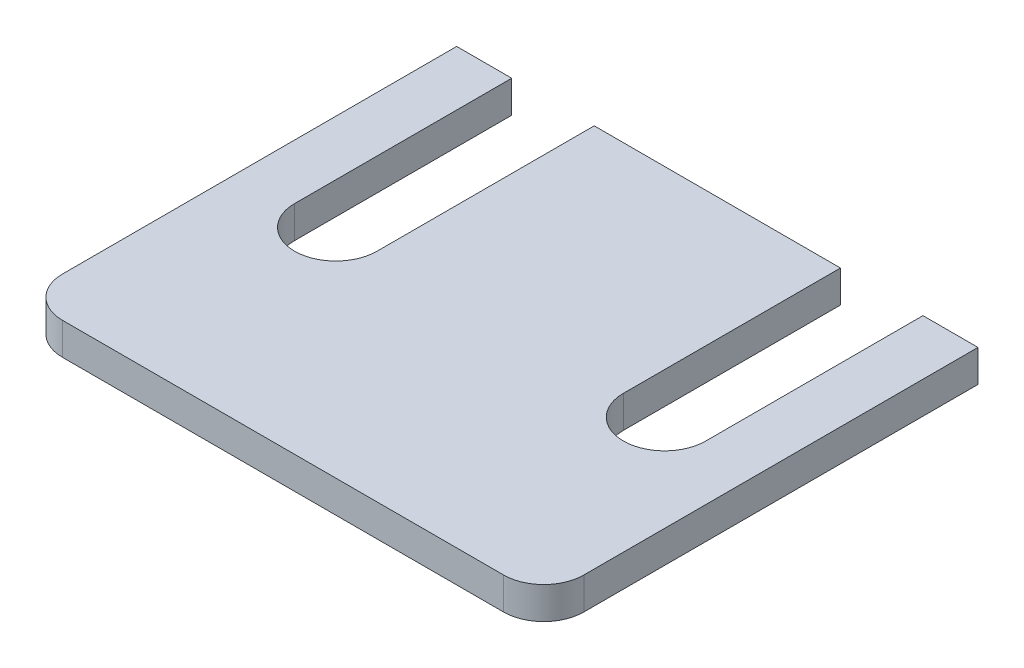
ISO-10303-21;
HEADER;
FILE_DESCRIPTION(('STEP AP214'),'2;1');
FILE_NAME('part.step','',(''),(''),'','','');
FILE_SCHEMA(('AUTOMOTIVE_DESIGN { 1 0 10303 214 1 1 1 1 }'));
ENDSEC;
DATA;
#1=APPLICATION_CONTEXT('core data for automotive mechanical design processes');
#2=APPLICATION_PROTOCOL_DEFINITION('international standard','automotive_design',2000,#1);
#3=PRODUCT_CONTEXT('',#1,'mechanical');
#4=PRODUCT('Part','Part','',(#3));
#5=PRODUCT_RELATED_PRODUCT_CATEGORY('part','',(#4));
#6=PRODUCT_DEFINITION_FORMATION('','',#4);
#7=PRODUCT_DEFINITION_CONTEXT('part definition',#1,'design');
#8=PRODUCT_DEFINITION('design','',#6,#7);
#9=PRODUCT_DEFINITION_SHAPE('','',#8);
#10=(LENGTH_UNIT() NAMED_UNIT(*) SI_UNIT(.MILLI.,.METRE.));
#11=(NAMED_UNIT(*) PLANE_ANGLE_UNIT() SI_UNIT($,.RADIAN.));
#12=(NAMED_UNIT(*) SI_UNIT($,.STERADIAN.) SOLID_ANGLE_UNIT());
#13=UNCERTAINTY_MEASURE_WITH_UNIT(LENGTH_MEASURE(1.E-05),#10,'distance_accuracy_value','');
#14=(GEOMETRIC_REPRESENTATION_CONTEXT(3) GLOBAL_UNCERTAINTY_ASSIGNED_CONTEXT((#13)) GLOBAL_UNIT_ASSIGNED_CONTEXT((#10,
#11,#12)) REPRESENTATION_CONTEXT('',''));
#15=CARTESIAN_POINT('',(0.,0.,0.));
#16=DIRECTION('',(0.,0.,1.));
#17=DIRECTION('',(1.,0.,0.));
#18=AXIS2_PLACEMENT_3D('',#15,#16,#17);
#19=CARTESIAN_POINT('',(-20.626678457,2.54,-17.1831));
#20=DIRECTION('',(0.,0.,1.));
#21=DIRECTION('',(1.,0.,0.));
#22=AXIS2_PLACEMENT_3D('',#19,#20,#21);
#23=PLANE('',#22);
#24=DIRECTION('',(-1.,0.,0.));
#25=VECTOR('',#24,1.);
#26=CARTESIAN_POINT('',(-20.626678457,2.54,-17.1831));
#27=LINE('',#26,#25);
#28=CARTESIAN_POINT('',(-16.270578457,2.54,-17.1831));
#29=VERTEX_POINT('',#28);
#30=CARTESIAN_POINT('',(-20.626678457,2.54,-17.1831));
#31=VERTEX_POINT('',#30);
#32=EDGE_CURVE('E216',#29,#31,#27,.T.);
#33=ORIENTED_EDGE('',*,*,#32,.F.);
#34=DIRECTION('',(0.,1.,0.));
#35=VECTOR('',#34,1.);
#36=CARTESIAN_POINT('',(-16.270578457,0.,-17.1831));
#37=LINE('',#36,#35);
#38=CARTESIAN_POINT('',(-16.270578457,0.,-17.1831));
#39=VERTEX_POINT('',#38);
#40=EDGE_CURVE('E154',#39,#29,#37,.T.);
#41=ORIENTED_EDGE('',*,*,#40,.F.);
#42=DIRECTION('',(-1.,0.,0.));
#43=VECTOR('',#42,1.);
#44=CARTESIAN_POINT('',(-20.626678457,0.,-17.1831));
#45=LINE('',#44,#43);
#46=CARTESIAN_POINT('',(-20.626678457,0.,-17.1831));
#47=VERTEX_POINT('',#46);
#48=EDGE_CURVE('E172',#39,#47,#45,.T.);
#49=ORIENTED_EDGE('',*,*,#48,.T.);
#50=DIRECTION('',(0.,-1.,0.));
#51=VECTOR('',#50,1.);
#52=CARTESIAN_POINT('',(-20.626678457,2.54,-17.1831));
#53=LINE('',#52,#51);
#54=EDGE_CURVE('E182',#31,#47,#53,.T.);
#55=ORIENTED_EDGE('',*,*,#54,.F.);
#56=EDGE_LOOP('',(#33,#41,#49,#55));
#57=FACE_BOUND('',#56,.T.);
#58=ADVANCED_FACE('F47',(#57),#23,.F.);
#59=CARTESIAN_POINT('',(9.742778457,0.,-17.1831));
#60=VERTEX_POINT('',#59);
#61=CARTESIAN_POINT('',(-9.742778457,0.,-17.1831));
#62=VERTEX_POINT('',#61);
#63=EDGE_CURVE('E163',#60,#62,#45,.T.);
#64=ORIENTED_EDGE('',*,*,#63,.T.);
#65=DIRECTION('',(0.,1.,0.));
#66=VECTOR('',#65,1.);
#67=CARTESIAN_POINT('',(-9.742778457,0.,-17.1831));
#68=LINE('',#67,#66);
#69=CARTESIAN_POINT('',(-9.742778457,2.54,-17.1831));
#70=VERTEX_POINT('',#69);
#71=EDGE_CURVE('E146',#62,#70,#68,.T.);
#72=ORIENTED_EDGE('',*,*,#71,.T.);
#73=CARTESIAN_POINT('',(9.742778457,2.54,-17.1831));
#74=VERTEX_POINT('',#73);
#75=EDGE_CURVE('E215',#74,#70,#27,.T.);
#76=ORIENTED_EDGE('',*,*,#75,.F.);
#77=DIRECTION('',(0.,1.,0.));
#78=VECTOR('',#77,1.);
#79=CARTESIAN_POINT('',(9.742778457,0.,-17.1831));
#80=LINE('',#79,#78);
#81=EDGE_CURVE('E170',#60,#74,#80,.T.);
#82=ORIENTED_EDGE('',*,*,#81,.F.);
#83=EDGE_LOOP('',(#64,#72,#76,#82));
#84=FACE_BOUND('',#83,.T.);
#85=ADVANCED_FACE('F169',(#84),#23,.F.);
#86=CARTESIAN_POINT('',(0.,2.54,0.));
#87=DIRECTION('',(0.,-1.,0.));
#88=DIRECTION('',(0.,0.,-1.));
#89=AXIS2_PLACEMENT_3D('',#86,#87,#88);
#90=PLANE('',#89);
#91=CARTESIAN_POINT('',(-13.006678457,2.54,0.));
#92=DIRECTION('',(0.,1.,0.));
#93=DIRECTION('',(0.,0.,1.));
#94=AXIS2_PLACEMENT_3D('',#91,#92,#93);
#95=CIRCLE('',#94,3.2639);
#96=CARTESIAN_POINT('',(-16.270578457,2.54,0.));
#97=VERTEX_POINT('',#96);
#98=CARTESIAN_POINT('',(-9.742778457,2.54,0.));
#99=VERTEX_POINT('',#98);
#100=EDGE_CURVE('E211',#97,#99,#95,.T.);
#101=ORIENTED_EDGE('',*,*,#100,.F.);
#102=DIRECTION('',(0.,0.,1.));
#103=VECTOR('',#102,1.);
#104=CARTESIAN_POINT('',(-16.270578457,2.54,0.));
#105=LINE('',#104,#103);
#106=EDGE_CURVE('E70',#29,#97,#105,.T.);
#107=ORIENTED_EDGE('',*,*,#106,.F.);
#108=ORIENTED_EDGE('',*,*,#32,.T.);
#109=DIRECTION('',(0.,0.,1.));
#110=VECTOR('',#109,1.);
#111=CARTESIAN_POINT('',(-20.626678457,2.54,17.1831));
#112=LINE('',#111,#110);
#113=CARTESIAN_POINT('',(-20.626678457,2.54,14.0081));
#114=VERTEX_POINT('',#113);
#115=EDGE_CURVE('E175',#31,#114,#112,.T.);
#116=ORIENTED_EDGE('',*,*,#115,.T.);
#117=CARTESIAN_POINT('',(-17.451678457,2.54,14.0081));
#118=DIRECTION('',(0.,-1.,0.));
#119=DIRECTION('',(0.,0.,-1.));
#120=AXIS2_PLACEMENT_3D('',#117,#118,#119);
#121=CIRCLE('',#120,3.175);
#122=CARTESIAN_POINT('',(-17.451678457,2.54,17.1831));
#123=VERTEX_POINT('',#122);
#124=EDGE_CURVE('E55',#114,#123,#121,.F.);
#125=ORIENTED_EDGE('',*,*,#124,.T.);
#126=DIRECTION('',(1.,0.,0.));
#127=VECTOR('',#126,1.);
#128=CARTESIAN_POINT('',(-20.626678457,2.54,17.1831));
#129=LINE('',#128,#127);
#130=CARTESIAN_POINT('',(17.451678457,2.54,17.1831));
#131=VERTEX_POINT('',#130);
#132=EDGE_CURVE('E219',#123,#131,#129,.T.);
#133=ORIENTED_EDGE('',*,*,#132,.T.);
#134=CARTESIAN_POINT('',(17.451678457,2.54,14.0081));
#135=DIRECTION('',(0.,-1.,0.));
#136=DIRECTION('',(0.,0.,-1.));
#137=AXIS2_PLACEMENT_3D('',#134,#135,#136);
#138=CIRCLE('',#137,3.175);
#139=CARTESIAN_POINT('',(20.626678457,2.54,14.0081));
#140=VERTEX_POINT('',#139);
#141=EDGE_CURVE('E278',#131,#140,#138,.F.);
#142=ORIENTED_EDGE('',*,*,#141,.T.);
#143=DIRECTION('',(0.,0.,-1.));
#144=VECTOR('',#143,1.);
#145=CARTESIAN_POINT('',(20.626678457,2.54,17.1831));
#146=LINE('',#145,#144);
#147=CARTESIAN_POINT('',(20.626678457,2.54,-17.1831));
#148=VERTEX_POINT('',#147);
#149=EDGE_CURVE('E217',#140,#148,#146,.T.);
#150=ORIENTED_EDGE('',*,*,#149,.T.);
#151=CARTESIAN_POINT('',(16.270578457,2.54,-17.1831));
#152=VERTEX_POINT('',#151);
#153=EDGE_CURVE('E212',#148,#152,#27,.T.);
#154=ORIENTED_EDGE('',*,*,#153,.T.);
#155=DIRECTION('',(0.,0.,-1.));
#156=VECTOR('',#155,1.);
#157=CARTESIAN_POINT('',(16.270578457,2.54,0.));
#158=LINE('',#157,#156);
#159=CARTESIAN_POINT('',(16.270578457,2.54,0.));
#160=VERTEX_POINT('',#159);
#161=EDGE_CURVE('E241',#160,#152,#158,.T.);
#162=ORIENTED_EDGE('',*,*,#161,.F.);
#163=CARTESIAN_POINT('',(13.006678457,2.54,0.));
#164=DIRECTION('',(0.,1.,0.));
#165=DIRECTION('',(0.,0.,-1.));
#166=AXIS2_PLACEMENT_3D('',#163,#164,#165);
#167=CIRCLE('',#166,3.2639);
#168=CARTESIAN_POINT('',(9.742778457,2.54,0.));
#169=VERTEX_POINT('',#168);
#170=EDGE_CURVE('E225',#169,#160,#167,.T.);
#171=ORIENTED_EDGE('',*,*,#170,.F.);
#172=DIRECTION('',(0.,0.,1.));
#173=VECTOR('',#172,1.);
#174=CARTESIAN_POINT('',(9.742778457,2.54,0.));
#175=LINE('',#174,#173);
#176=EDGE_CURVE('E237',#74,#169,#175,.T.);
#177=ORIENTED_EDGE('',*,*,#176,.F.);
#178=ORIENTED_EDGE('',*,*,#75,.T.);
#179=DIRECTION('',(0.,0.,-1.));
#180=VECTOR('',#179,1.);
#181=CARTESIAN_POINT('',(-9.742778457,2.54,0.));
#182=LINE('',#181,#180);
#183=EDGE_CURVE('E149',#99,#70,#182,.T.);
#184=ORIENTED_EDGE('',*,*,#183,.F.);
#185=EDGE_LOOP('',(#101,#107,#108,#116,#125,#133,#142,#150,#154,#162,#171,#177,#178,#184));
#186=FACE_BOUND('',#185,.T.);
#187=ADVANCED_FACE('F264',(#186),#90,.F.);
#188=CARTESIAN_POINT('',(0.,0.,0.));
#189=DIRECTION('',(0.,-1.,0.));
#190=DIRECTION('',(0.,0.,-1.));
#191=AXIS2_PLACEMENT_3D('',#188,#189,#190);
#192=PLANE('',#191);
#193=DIRECTION('',(0.,0.,1.));
#194=VECTOR('',#193,1.);
#195=CARTESIAN_POINT('',(-16.270578457,0.,0.));
#196=LINE('',#195,#194);
#197=CARTESIAN_POINT('',(-16.270578457,0.,0.));
#198=VERTEX_POINT('',#197);
#199=EDGE_CURVE('E166',#39,#198,#196,.T.);
#200=ORIENTED_EDGE('',*,*,#199,.T.);
#201=CARTESIAN_POINT('',(-13.006678457,0.,0.));
#202=DIRECTION('',(0.,1.,0.));
#203=DIRECTION('',(0.,0.,1.));
#204=AXIS2_PLACEMENT_3D('',#201,#202,#203);
#205=CIRCLE('',#204,3.2639);
#206=CARTESIAN_POINT('',(-9.742778457,0.,0.));
#207=VERTEX_POINT('',#206);
#208=EDGE_CURVE('E165',#198,#207,#205,.T.);
#209=ORIENTED_EDGE('',*,*,#208,.T.);
#210=DIRECTION('',(0.,0.,-1.));
#211=VECTOR('',#210,1.);
#212=CARTESIAN_POINT('',(-9.742778457,0.,0.));
#213=LINE('',#212,#211);
#214=EDGE_CURVE('E62',#207,#62,#213,.T.);
#215=ORIENTED_EDGE('',*,*,#214,.T.);
#216=ORIENTED_EDGE('',*,*,#63,.F.);
#217=DIRECTION('',(0.,0.,1.));
#218=VECTOR('',#217,1.);
#219=CARTESIAN_POINT('',(9.742778457,0.,0.));
#220=LINE('',#219,#218);
#221=CARTESIAN_POINT('',(9.742778457,0.,0.));
#222=VERTEX_POINT('',#221);
#223=EDGE_CURVE('E238',#60,#222,#220,.T.);
#224=ORIENTED_EDGE('',*,*,#223,.T.);
#225=CARTESIAN_POINT('',(13.006678457,0.,0.));
#226=DIRECTION('',(0.,1.,0.));
#227=DIRECTION('',(0.,0.,-1.));
#228=AXIS2_PLACEMENT_3D('',#225,#226,#227);
#229=CIRCLE('',#228,3.2639);
#230=CARTESIAN_POINT('',(16.270578457,0.,0.));
#231=VERTEX_POINT('',#230);
#232=EDGE_CURVE('E227',#222,#231,#229,.T.);
#233=ORIENTED_EDGE('',*,*,#232,.T.);
#234=DIRECTION('',(0.,0.,-1.));
#235=VECTOR('',#234,1.);
#236=CARTESIAN_POINT('',(16.270578457,0.,0.));
#237=LINE('',#236,#235);
#238=CARTESIAN_POINT('',(16.270578457,0.,-17.1831));
#239=VERTEX_POINT('',#238);
#240=EDGE_CURVE('E234',#231,#239,#237,.T.);
#241=ORIENTED_EDGE('',*,*,#240,.T.);
#242=CARTESIAN_POINT('',(20.626678457,0.,-17.1831));
#243=VERTEX_POINT('',#242);
#244=EDGE_CURVE('E171',#243,#239,#45,.T.);
#245=ORIENTED_EDGE('',*,*,#244,.F.);
#246=DIRECTION('',(0.,0.,-1.));
#247=VECTOR('',#246,1.);
#248=CARTESIAN_POINT('',(20.626678457,0.,17.1831));
#249=LINE('',#248,#247);
#250=CARTESIAN_POINT('',(20.626678457,0.,14.0081));
#251=VERTEX_POINT('',#250);
#252=EDGE_CURVE('E176',#251,#243,#249,.T.);
#253=ORIENTED_EDGE('',*,*,#252,.F.);
#254=CARTESIAN_POINT('',(17.451678457,0.,14.0081));
#255=DIRECTION('',(0.,-1.,0.));
#256=DIRECTION('',(0.,0.,-1.));
#257=AXIS2_PLACEMENT_3D('',#254,#255,#256);
#258=CIRCLE('',#257,3.175);
#259=CARTESIAN_POINT('',(17.451678457,0.,17.1831));
#260=VERTEX_POINT('',#259);
#261=EDGE_CURVE('E190',#251,#260,#258,.T.);
#262=ORIENTED_EDGE('',*,*,#261,.T.);
#263=DIRECTION('',(1.,0.,0.));
#264=VECTOR('',#263,1.);
#265=CARTESIAN_POINT('',(-20.626678457,0.,17.1831));
#266=LINE('',#265,#264);
#267=CARTESIAN_POINT('',(-17.451678457,0.,17.1831));
#268=VERTEX_POINT('',#267);
#269=EDGE_CURVE('E204',#268,#260,#266,.T.);
#270=ORIENTED_EDGE('',*,*,#269,.F.);
#271=CARTESIAN_POINT('',(-17.451678457,0.,14.0081));
#272=DIRECTION('',(0.,-1.,0.));
#273=DIRECTION('',(0.,0.,-1.));
#274=AXIS2_PLACEMENT_3D('',#271,#272,#273);
#275=CIRCLE('',#274,3.175);
#276=CARTESIAN_POINT('',(-20.626678457,0.,14.0081));
#277=VERTEX_POINT('',#276);
#278=EDGE_CURVE('E194',#268,#277,#275,.T.);
#279=ORIENTED_EDGE('',*,*,#278,.T.);
#280=DIRECTION('',(0.,0.,1.));
#281=VECTOR('',#280,1.);
#282=CARTESIAN_POINT('',(-20.626678457,0.,17.1831));
#283=LINE('',#282,#281);
#284=EDGE_CURVE('E207',#47,#277,#283,.T.);
#285=ORIENTED_EDGE('',*,*,#284,.F.);
#286=ORIENTED_EDGE('',*,*,#48,.F.);
#287=EDGE_LOOP('',(#200,#209,#215,#216,#224,#233,#241,#245,#253,#262,#270,#279,#285,#286));
#288=FACE_BOUND('',#287,.T.);
#289=ADVANCED_FACE('F161',(#288),#192,.T.);
#290=CARTESIAN_POINT('',(-20.626678457,2.54,17.1831));
#291=DIRECTION('',(1.,0.,0.));
#292=DIRECTION('',(0.,0.,-1.));
#293=AXIS2_PLACEMENT_3D('',#290,#291,#292);
#294=PLANE('',#293);
#295=ORIENTED_EDGE('',*,*,#284,.T.);
#296=DIRECTION('',(0.,-1.,0.));
#297=VECTOR('',#296,1.);
#298=CARTESIAN_POINT('',(-20.626678457,2.54,14.0081));
#299=LINE('',#298,#297);
#300=EDGE_CURVE('E199',#277,#114,#299,.F.);
#301=ORIENTED_EDGE('',*,*,#300,.T.);
#302=ORIENTED_EDGE('',*,*,#115,.F.);
#303=ORIENTED_EDGE('',*,*,#54,.T.);
#304=EDGE_LOOP('',(#295,#301,#302,#303));
#305=FACE_BOUND('',#304,.T.);
#306=ADVANCED_FACE('F275',(#305),#294,.F.);
#307=CARTESIAN_POINT('',(-20.626678457,2.54,17.1831));
#308=DIRECTION('',(0.,0.,-1.));
#309=DIRECTION('',(-1.,0.,0.));
#310=AXIS2_PLACEMENT_3D('',#307,#308,#309);
#311=PLANE('',#310);
#312=ORIENTED_EDGE('',*,*,#132,.F.);
#313=DIRECTION('',(0.,-1.,0.));
#314=VECTOR('',#313,1.);
#315=CARTESIAN_POINT('',(-17.451678457,2.54,17.1831));
#316=LINE('',#315,#314);
#317=EDGE_CURVE('E195',#123,#268,#316,.T.);
#318=ORIENTED_EDGE('',*,*,#317,.T.);
#319=ORIENTED_EDGE('',*,*,#269,.T.);
#320=DIRECTION('',(0.,-1.,0.));
#321=VECTOR('',#320,1.);
#322=CARTESIAN_POINT('',(17.451678457,2.54,17.1831));
#323=LINE('',#322,#321);
#324=EDGE_CURVE('E288',#260,#131,#323,.F.);
#325=ORIENTED_EDGE('',*,*,#324,.T.);
#326=EDGE_LOOP('',(#312,#318,#319,#325));
#327=FACE_BOUND('',#326,.T.);
#328=ADVANCED_FACE('F285',(#327),#311,.F.);
#329=CARTESIAN_POINT('',(20.626678457,2.54,17.1831));
#330=DIRECTION('',(-1.,0.,0.));
#331=DIRECTION('',(0.,0.,1.));
#332=AXIS2_PLACEMENT_3D('',#329,#330,#331);
#333=PLANE('',#332);
#334=ORIENTED_EDGE('',*,*,#149,.F.);
#335=DIRECTION('',(0.,-1.,0.));
#336=VECTOR('',#335,1.);
#337=CARTESIAN_POINT('',(20.626678457,2.54,14.0081));
#338=LINE('',#337,#336);
#339=EDGE_CURVE('E12',#140,#251,#338,.T.);
#340=ORIENTED_EDGE('',*,*,#339,.T.);
#341=ORIENTED_EDGE('',*,*,#252,.T.);
#342=DIRECTION('',(0.,-1.,0.));
#343=VECTOR('',#342,1.);
#344=CARTESIAN_POINT('',(20.626678457,2.54,-17.1831));
#345=LINE('',#344,#343);
#346=EDGE_CURVE('E274',#148,#243,#345,.T.);
#347=ORIENTED_EDGE('',*,*,#346,.F.);
#348=EDGE_LOOP('',(#334,#340,#341,#347));
#349=FACE_BOUND('',#348,.T.);
#350=ADVANCED_FACE('F306',(#349),#333,.F.);
#351=ORIENTED_EDGE('',*,*,#244,.T.);
#352=DIRECTION('',(0.,1.,0.));
#353=VECTOR('',#352,1.);
#354=CARTESIAN_POINT('',(16.270578457,0.,-17.1831));
#355=LINE('',#354,#353);
#356=EDGE_CURVE('E248',#239,#152,#355,.T.);
#357=ORIENTED_EDGE('',*,*,#356,.T.);
#358=ORIENTED_EDGE('',*,*,#153,.F.);
#359=ORIENTED_EDGE('',*,*,#346,.T.);
#360=EDGE_LOOP('',(#351,#357,#358,#359));
#361=FACE_BOUND('',#360,.T.);
#362=ADVANCED_FACE('F295',(#361),#23,.F.);
#363=CARTESIAN_POINT('',(-13.006678457,2.54,0.));
#364=DIRECTION('',(0.,-1.,0.));
#365=DIRECTION('',(0.,0.,-1.));
#366=AXIS2_PLACEMENT_3D('',#363,#364,#365);
#367=CYLINDRICAL_SURFACE('',#366,3.2639);
#368=DIRECTION('',(0.,1.,0.));
#369=VECTOR('',#368,1.);
#370=CARTESIAN_POINT('',(-16.270578457,0.,0.));
#371=LINE('',#370,#369);
#372=EDGE_CURVE('E231',#198,#97,#371,.T.);
#373=ORIENTED_EDGE('',*,*,#372,.T.);
#374=ORIENTED_EDGE('',*,*,#100,.T.);
#375=DIRECTION('',(0.,1.,0.));
#376=VECTOR('',#375,1.);
#377=CARTESIAN_POINT('',(-9.742778457,0.,0.));
#378=LINE('',#377,#376);
#379=EDGE_CURVE('E155',#207,#99,#378,.T.);
#380=ORIENTED_EDGE('',*,*,#379,.F.);
#381=ORIENTED_EDGE('',*,*,#208,.F.);
#382=EDGE_LOOP('',(#373,#374,#380,#381));
#383=FACE_BOUND('',#382,.T.);
#384=ADVANCED_FACE('F261',(#383),#367,.F.);
#385=CARTESIAN_POINT('',(13.006678457,2.54,0.));
#386=DIRECTION('',(0.,-1.,0.));
#387=DIRECTION('',(0.,0.,-1.));
#388=AXIS2_PLACEMENT_3D('',#385,#386,#387);
#389=CYLINDRICAL_SURFACE('',#388,3.2639);
#390=DIRECTION('',(0.,1.,0.));
#391=VECTOR('',#390,1.);
#392=CARTESIAN_POINT('',(9.742778457,0.,0.));
#393=LINE('',#392,#391);
#394=EDGE_CURVE('E244',#222,#169,#393,.T.);
#395=ORIENTED_EDGE('',*,*,#394,.T.);
#396=ORIENTED_EDGE('',*,*,#170,.T.);
#397=DIRECTION('',(0.,1.,0.));
#398=VECTOR('',#397,1.);
#399=CARTESIAN_POINT('',(16.270578457,0.,0.));
#400=LINE('',#399,#398);
#401=EDGE_CURVE('E240',#231,#160,#400,.T.);
#402=ORIENTED_EDGE('',*,*,#401,.F.);
#403=ORIENTED_EDGE('',*,*,#232,.F.);
#404=EDGE_LOOP('',(#395,#396,#402,#403));
#405=FACE_BOUND('',#404,.T.);
#406=ADVANCED_FACE('F304',(#405),#389,.F.);
#407=CARTESIAN_POINT('',(-17.451678457,2.54,14.0081));
#408=DIRECTION('',(0.,-1.,0.));
#409=DIRECTION('',(0.,0.,-1.));
#410=AXIS2_PLACEMENT_3D('',#407,#408,#409);
#411=CYLINDRICAL_SURFACE('',#410,3.175);
#412=ORIENTED_EDGE('',*,*,#124,.F.);
#413=ORIENTED_EDGE('',*,*,#300,.F.);
#414=ORIENTED_EDGE('',*,*,#278,.F.);
#415=ORIENTED_EDGE('',*,*,#317,.F.);
#416=EDGE_LOOP('',(#412,#413,#414,#415));
#417=FACE_BOUND('',#416,.T.);
#418=ADVANCED_FACE('F289',(#417),#411,.T.);
#419=CARTESIAN_POINT('',(17.451678457,2.54,14.0081));
#420=DIRECTION('',(0.,-1.,0.));
#421=DIRECTION('',(0.,0.,-1.));
#422=AXIS2_PLACEMENT_3D('',#419,#420,#421);
#423=CYLINDRICAL_SURFACE('',#422,3.175);
#424=ORIENTED_EDGE('',*,*,#141,.F.);
#425=ORIENTED_EDGE('',*,*,#324,.F.);
#426=ORIENTED_EDGE('',*,*,#261,.F.);
#427=ORIENTED_EDGE('',*,*,#339,.F.);
#428=EDGE_LOOP('',(#424,#425,#426,#427));
#429=FACE_BOUND('',#428,.T.);
#430=ADVANCED_FACE('F49',(#429),#423,.T.);
#431=CARTESIAN_POINT('',(16.270578457,0.,0.));
#432=DIRECTION('',(1.,0.,0.));
#433=DIRECTION('',(0.,0.,-1.));
#434=AXIS2_PLACEMENT_3D('',#431,#432,#433);
#435=PLANE('',#434);
#436=ORIENTED_EDGE('',*,*,#161,.T.);
#437=ORIENTED_EDGE('',*,*,#356,.F.);
#438=ORIENTED_EDGE('',*,*,#240,.F.);
#439=ORIENTED_EDGE('',*,*,#401,.T.);
#440=EDGE_LOOP('',(#436,#437,#438,#439));
#441=FACE_BOUND('',#440,.T.);
#442=ADVANCED_FACE('F301',(#441),#435,.F.);
#443=CARTESIAN_POINT('',(9.742778457,0.,0.));
#444=DIRECTION('',(-1.,0.,0.));
#445=DIRECTION('',(0.,0.,1.));
#446=AXIS2_PLACEMENT_3D('',#443,#444,#445);
#447=PLANE('',#446);
#448=ORIENTED_EDGE('',*,*,#176,.T.);
#449=ORIENTED_EDGE('',*,*,#394,.F.);
#450=ORIENTED_EDGE('',*,*,#223,.F.);
#451=ORIENTED_EDGE('',*,*,#81,.T.);
#452=EDGE_LOOP('',(#448,#449,#450,#451));
#453=FACE_BOUND('',#452,.T.);
#454=ADVANCED_FACE('F314',(#453),#447,.F.);
#455=CARTESIAN_POINT('',(-9.742778457,0.,0.));
#456=DIRECTION('',(1.,0.,0.));
#457=DIRECTION('',(0.,0.,-1.));
#458=AXIS2_PLACEMENT_3D('',#455,#456,#457);
#459=PLANE('',#458);
#460=ORIENTED_EDGE('',*,*,#183,.T.);
#461=ORIENTED_EDGE('',*,*,#71,.F.);
#462=ORIENTED_EDGE('',*,*,#214,.F.);
#463=ORIENTED_EDGE('',*,*,#379,.T.);
#464=EDGE_LOOP('',(#460,#461,#462,#463));
#465=FACE_BOUND('',#464,.T.);
#466=ADVANCED_FACE('F147',(#465),#459,.F.);
#467=CARTESIAN_POINT('',(-16.270578457,0.,0.));
#468=DIRECTION('',(-1.,0.,0.));
#469=DIRECTION('',(0.,0.,1.));
#470=AXIS2_PLACEMENT_3D('',#467,#468,#469);
#471=PLANE('',#470);
#472=ORIENTED_EDGE('',*,*,#106,.T.);
#473=ORIENTED_EDGE('',*,*,#372,.F.);
#474=ORIENTED_EDGE('',*,*,#199,.F.);
#475=ORIENTED_EDGE('',*,*,#40,.T.);
#476=EDGE_LOOP('',(#472,#473,#474,#475));
#477=FACE_BOUND('',#476,.T.);
#478=ADVANCED_FACE('F349',(#477),#471,.F.);
#479=CLOSED_SHELL('',(#58,#85,#187,#289,#306,#328,#350,#362,#384,#406,#418,#430,#442,#454,#466,#478));
#480=MANIFOLD_SOLID_BREP('B2',#479);
#481=ADVANCED_BREP_SHAPE_REPRESENTATION('',(#18,#480),#14);
#482=SHAPE_DEFINITION_REPRESENTATION(#9,#481);
ENDSEC;
END-ISO-10303-21;
